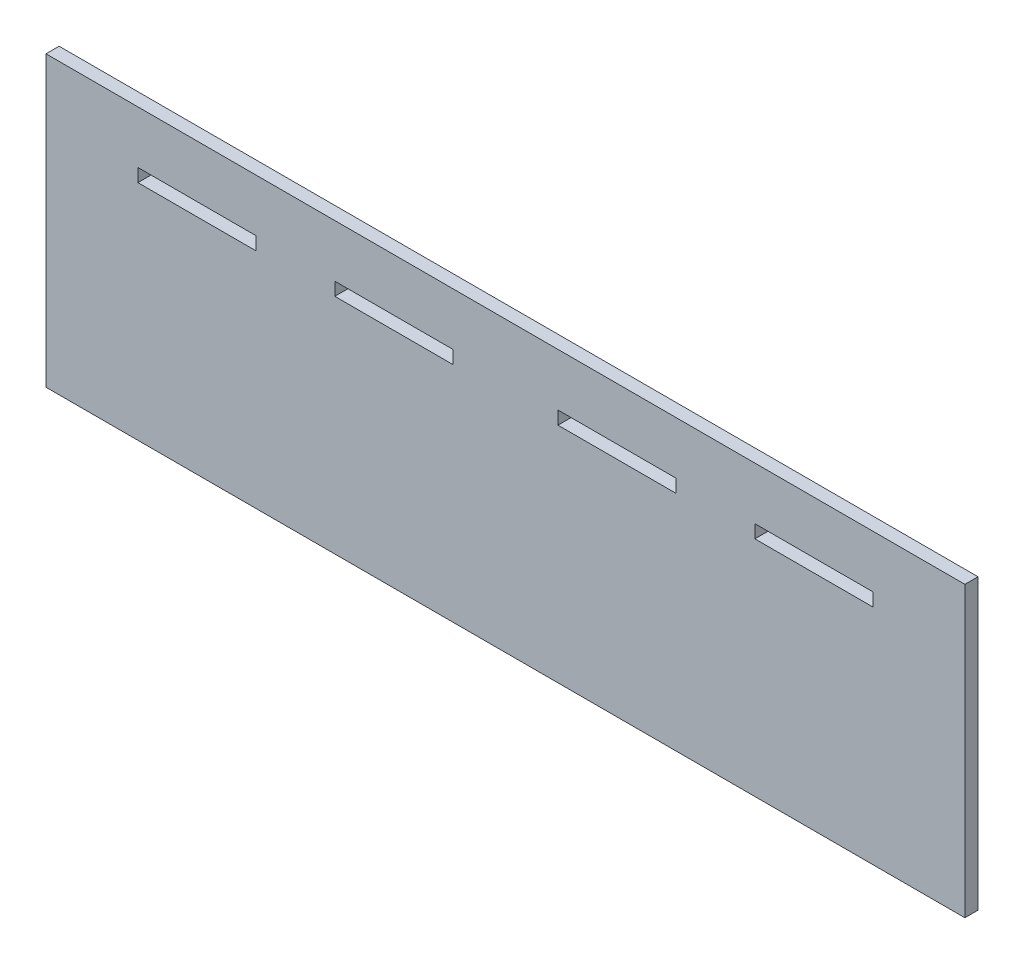
ISO-10303-21;
HEADER;
FILE_DESCRIPTION(('STEP AP214'),'2;1');
FILE_NAME('part.step','',(''),(''),'','','');
FILE_SCHEMA(('AUTOMOTIVE_DESIGN { 1 0 10303 214 1 1 1 1 }'));
ENDSEC;
DATA;
#1=APPLICATION_CONTEXT('core data for automotive mechanical design processes');
#2=APPLICATION_PROTOCOL_DEFINITION('international standard','automotive_design',2000,#1);
#3=PRODUCT_CONTEXT('',#1,'mechanical');
#4=PRODUCT('Part','Part','',(#3));
#5=PRODUCT_RELATED_PRODUCT_CATEGORY('part','',(#4));
#6=PRODUCT_DEFINITION_FORMATION('','',#4);
#7=PRODUCT_DEFINITION_CONTEXT('part definition',#1,'design');
#8=PRODUCT_DEFINITION('design','',#6,#7);
#9=PRODUCT_DEFINITION_SHAPE('','',#8);
#10=(LENGTH_UNIT() NAMED_UNIT(*) SI_UNIT(.MILLI.,.METRE.));
#11=(NAMED_UNIT(*) PLANE_ANGLE_UNIT() SI_UNIT($,.RADIAN.));
#12=(NAMED_UNIT(*) SI_UNIT($,.STERADIAN.) SOLID_ANGLE_UNIT());
#13=UNCERTAINTY_MEASURE_WITH_UNIT(LENGTH_MEASURE(1.E-05),#10,'distance_accuracy_value','');
#14=(GEOMETRIC_REPRESENTATION_CONTEXT(3) GLOBAL_UNCERTAINTY_ASSIGNED_CONTEXT((#13)) GLOBAL_UNIT_ASSIGNED_CONTEXT((#10,
#11,#12)) REPRESENTATION_CONTEXT('',''));
#15=CARTESIAN_POINT('',(0.,0.,0.));
#16=DIRECTION('',(0.,0.,1.));
#17=DIRECTION('',(1.,0.,0.));
#18=AXIS2_PLACEMENT_3D('',#15,#16,#17);
#19=CARTESIAN_POINT('',(0.,0.,10.));
#20=DIRECTION('',(0.,0.,-1.));
#21=DIRECTION('',(-1.,0.,0.));
#22=AXIS2_PLACEMENT_3D('',#19,#20,#21);
#23=PLANE('',#22);
#24=DIRECTION('',(0.,-1.,0.));
#25=VECTOR('',#24,1.);
#26=CARTESIAN_POINT('',(540.,180.,10.));
#27=LINE('',#26,#25);
#28=CARTESIAN_POINT('',(540.,180.,10.));
#29=VERTEX_POINT('',#28);
#30=CARTESIAN_POINT('',(540.,170.,10.));
#31=VERTEX_POINT('',#30);
#32=EDGE_CURVE('E206',#29,#31,#27,.T.);
#33=ORIENTED_EDGE('',*,*,#32,.F.);
#34=DIRECTION('',(-1.,0.,0.));
#35=VECTOR('',#34,1.);
#36=CARTESIAN_POINT('',(540.,180.,10.));
#37=LINE('',#36,#35);
#38=CARTESIAN_POINT('',(630.,180.,10.));
#39=VERTEX_POINT('',#38);
#40=EDGE_CURVE('E214',#39,#29,#37,.T.);
#41=ORIENTED_EDGE('',*,*,#40,.F.);
#42=DIRECTION('',(0.,1.,0.));
#43=VECTOR('',#42,1.);
#44=CARTESIAN_POINT('',(630.,180.,10.));
#45=LINE('',#44,#43);
#46=CARTESIAN_POINT('',(630.,170.,10.));
#47=VERTEX_POINT('',#46);
#48=EDGE_CURVE('E211',#47,#39,#45,.T.);
#49=ORIENTED_EDGE('',*,*,#48,.F.);
#50=DIRECTION('',(1.,0.,0.));
#51=VECTOR('',#50,1.);
#52=CARTESIAN_POINT('',(540.,170.,10.));
#53=LINE('',#52,#51);
#54=EDGE_CURVE('E208',#31,#47,#53,.T.);
#55=ORIENTED_EDGE('',*,*,#54,.F.);
#56=EDGE_LOOP('',(#33,#41,#49,#55));
#57=FACE_BOUND('',#56,.T.);
#58=DIRECTION('',(0.,-1.,0.));
#59=VECTOR('',#58,1.);
#60=CARTESIAN_POINT('',(220.,180.,10.));
#61=LINE('',#60,#59);
#62=CARTESIAN_POINT('',(220.,180.,10.));
#63=VERTEX_POINT('',#62);
#64=CARTESIAN_POINT('',(220.,170.,10.));
#65=VERTEX_POINT('',#64);
#66=EDGE_CURVE('E268',#63,#65,#61,.T.);
#67=ORIENTED_EDGE('',*,*,#66,.F.);
#68=DIRECTION('',(-1.,0.,0.));
#69=VECTOR('',#68,1.);
#70=CARTESIAN_POINT('',(220.,180.,10.));
#71=LINE('',#70,#69);
#72=CARTESIAN_POINT('',(310.,180.,10.));
#73=VERTEX_POINT('',#72);
#74=EDGE_CURVE('E276',#73,#63,#71,.T.);
#75=ORIENTED_EDGE('',*,*,#74,.F.);
#76=DIRECTION('',(0.,1.,0.));
#77=VECTOR('',#76,1.);
#78=CARTESIAN_POINT('',(310.,180.,10.));
#79=LINE('',#78,#77);
#80=CARTESIAN_POINT('',(310.,170.,10.));
#81=VERTEX_POINT('',#80);
#82=EDGE_CURVE('E273',#81,#73,#79,.T.);
#83=ORIENTED_EDGE('',*,*,#82,.F.);
#84=DIRECTION('',(1.,0.,0.));
#85=VECTOR('',#84,1.);
#86=CARTESIAN_POINT('',(220.,170.,10.));
#87=LINE('',#86,#85);
#88=EDGE_CURVE('E270',#65,#81,#87,.T.);
#89=ORIENTED_EDGE('',*,*,#88,.F.);
#90=EDGE_LOOP('',(#67,#75,#83,#89));
#91=FACE_BOUND('',#90,.T.);
#92=DIRECTION('',(0.,-1.,0.));
#93=VECTOR('',#92,1.);
#94=CARTESIAN_POINT('',(0.,0.,10.));
#95=LINE('',#94,#93);
#96=CARTESIAN_POINT('',(0.,220.,10.));
#97=VERTEX_POINT('',#96);
#98=CARTESIAN_POINT('',(0.,0.,10.));
#99=VERTEX_POINT('',#98);
#100=EDGE_CURVE('E299',#97,#99,#95,.T.);
#101=ORIENTED_EDGE('',*,*,#100,.T.);
#102=DIRECTION('',(1.,0.,0.));
#103=VECTOR('',#102,1.);
#104=CARTESIAN_POINT('',(0.,0.,10.));
#105=LINE('',#104,#103);
#106=CARTESIAN_POINT('',(700.,0.,10.));
#107=VERTEX_POINT('',#106);
#108=EDGE_CURVE('E302',#99,#107,#105,.T.);
#109=ORIENTED_EDGE('',*,*,#108,.T.);
#110=DIRECTION('',(0.,1.,0.));
#111=VECTOR('',#110,1.);
#112=CARTESIAN_POINT('',(700.,0.,10.));
#113=LINE('',#112,#111);
#114=CARTESIAN_POINT('',(700.,220.,10.));
#115=VERTEX_POINT('',#114);
#116=EDGE_CURVE('E305',#107,#115,#113,.T.);
#117=ORIENTED_EDGE('',*,*,#116,.T.);
#118=DIRECTION('',(-1.,0.,0.));
#119=VECTOR('',#118,1.);
#120=CARTESIAN_POINT('',(0.,220.,10.));
#121=LINE('',#120,#119);
#122=EDGE_CURVE('E307',#115,#97,#121,.T.);
#123=ORIENTED_EDGE('',*,*,#122,.T.);
#124=EDGE_LOOP('',(#101,#109,#117,#123));
#125=FACE_BOUND('',#124,.T.);
#126=DIRECTION('',(0.,-1.,0.));
#127=VECTOR('',#126,1.);
#128=CARTESIAN_POINT('',(390.,180.,10.));
#129=LINE('',#128,#127);
#130=CARTESIAN_POINT('',(390.,180.,10.));
#131=VERTEX_POINT('',#130);
#132=CARTESIAN_POINT('',(390.,170.,10.));
#133=VERTEX_POINT('',#132);
#134=EDGE_CURVE('E237',#131,#133,#129,.T.);
#135=ORIENTED_EDGE('',*,*,#134,.F.);
#136=DIRECTION('',(-1.,0.,0.));
#137=VECTOR('',#136,1.);
#138=CARTESIAN_POINT('',(390.,180.,10.));
#139=LINE('',#138,#137);
#140=CARTESIAN_POINT('',(480.,180.,10.));
#141=VERTEX_POINT('',#140);
#142=EDGE_CURVE('E245',#141,#131,#139,.T.);
#143=ORIENTED_EDGE('',*,*,#142,.F.);
#144=DIRECTION('',(0.,1.,0.));
#145=VECTOR('',#144,1.);
#146=CARTESIAN_POINT('',(480.,180.,10.));
#147=LINE('',#146,#145);
#148=CARTESIAN_POINT('',(480.,170.,10.));
#149=VERTEX_POINT('',#148);
#150=EDGE_CURVE('E242',#149,#141,#147,.T.);
#151=ORIENTED_EDGE('',*,*,#150,.F.);
#152=DIRECTION('',(1.,0.,0.));
#153=VECTOR('',#152,1.);
#154=CARTESIAN_POINT('',(390.,170.,10.));
#155=LINE('',#154,#153);
#156=EDGE_CURVE('E239',#133,#149,#155,.T.);
#157=ORIENTED_EDGE('',*,*,#156,.F.);
#158=EDGE_LOOP('',(#135,#143,#151,#157));
#159=FACE_BOUND('',#158,.T.);
#160=DIRECTION('',(0.,-1.,0.));
#161=VECTOR('',#160,1.);
#162=CARTESIAN_POINT('',(70.,180.,10.));
#163=LINE('',#162,#161);
#164=CARTESIAN_POINT('',(70.,180.,10.));
#165=VERTEX_POINT('',#164);
#166=CARTESIAN_POINT('',(70.,170.,10.));
#167=VERTEX_POINT('',#166);
#168=EDGE_CURVE('E170',#165,#167,#163,.T.);
#169=ORIENTED_EDGE('',*,*,#168,.F.);
#170=DIRECTION('',(-1.,0.,0.));
#171=VECTOR('',#170,1.);
#172=CARTESIAN_POINT('',(70.,180.,10.));
#173=LINE('',#172,#171);
#174=CARTESIAN_POINT('',(160.,180.,10.));
#175=VERTEX_POINT('',#174);
#176=EDGE_CURVE('E192',#175,#165,#173,.T.);
#177=ORIENTED_EDGE('',*,*,#176,.F.);
#178=DIRECTION('',(0.,1.,0.));
#179=VECTOR('',#178,1.);
#180=CARTESIAN_POINT('',(160.,180.,10.));
#181=LINE('',#180,#179);
#182=CARTESIAN_POINT('',(160.,170.,10.));
#183=VERTEX_POINT('',#182);
#184=EDGE_CURVE('E190',#183,#175,#181,.T.);
#185=ORIENTED_EDGE('',*,*,#184,.F.);
#186=DIRECTION('',(1.,0.,0.));
#187=VECTOR('',#186,1.);
#188=CARTESIAN_POINT('',(70.,170.,10.));
#189=LINE('',#188,#187);
#190=EDGE_CURVE('E178',#167,#183,#189,.T.);
#191=ORIENTED_EDGE('',*,*,#190,.F.);
#192=EDGE_LOOP('',(#169,#177,#185,#191));
#193=FACE_BOUND('',#192,.T.);
#194=ADVANCED_FACE('F33',(#57,#91,#125,#159,#193),#23,.F.);
#195=CARTESIAN_POINT('',(0.,0.,0.));
#196=DIRECTION('',(0.,0.,-1.));
#197=DIRECTION('',(-1.,0.,0.));
#198=AXIS2_PLACEMENT_3D('',#195,#196,#197);
#199=PLANE('',#198);
#200=DIRECTION('',(-1.,0.,0.));
#201=VECTOR('',#200,1.);
#202=CARTESIAN_POINT('',(540.,180.,0.));
#203=LINE('',#202,#201);
#204=CARTESIAN_POINT('',(630.,180.,0.));
#205=VERTEX_POINT('',#204);
#206=CARTESIAN_POINT('',(540.,180.,0.));
#207=VERTEX_POINT('',#206);
#208=EDGE_CURVE('E209',#205,#207,#203,.T.);
#209=ORIENTED_EDGE('',*,*,#208,.T.);
#210=DIRECTION('',(0.,-1.,0.));
#211=VECTOR('',#210,1.);
#212=CARTESIAN_POINT('',(540.,180.,0.));
#213=LINE('',#212,#211);
#214=CARTESIAN_POINT('',(540.,170.,0.));
#215=VERTEX_POINT('',#214);
#216=EDGE_CURVE('E186',#207,#215,#213,.T.);
#217=ORIENTED_EDGE('',*,*,#216,.T.);
#218=DIRECTION('',(1.,0.,0.));
#219=VECTOR('',#218,1.);
#220=CARTESIAN_POINT('',(540.,170.,0.));
#221=LINE('',#220,#219);
#222=CARTESIAN_POINT('',(630.,170.,0.));
#223=VERTEX_POINT('',#222);
#224=EDGE_CURVE('E219',#215,#223,#221,.T.);
#225=ORIENTED_EDGE('',*,*,#224,.T.);
#226=DIRECTION('',(0.,1.,0.));
#227=VECTOR('',#226,1.);
#228=CARTESIAN_POINT('',(630.,180.,0.));
#229=LINE('',#228,#227);
#230=EDGE_CURVE('E222',#223,#205,#229,.T.);
#231=ORIENTED_EDGE('',*,*,#230,.T.);
#232=EDGE_LOOP('',(#209,#217,#225,#231));
#233=FACE_BOUND('',#232,.T.);
#234=DIRECTION('',(-1.,0.,0.));
#235=VECTOR('',#234,1.);
#236=CARTESIAN_POINT('',(220.,180.,0.));
#237=LINE('',#236,#235);
#238=CARTESIAN_POINT('',(310.,180.,0.));
#239=VERTEX_POINT('',#238);
#240=CARTESIAN_POINT('',(220.,180.,0.));
#241=VERTEX_POINT('',#240);
#242=EDGE_CURVE('E271',#239,#241,#237,.T.);
#243=ORIENTED_EDGE('',*,*,#242,.T.);
#244=DIRECTION('',(0.,-1.,0.));
#245=VECTOR('',#244,1.);
#246=CARTESIAN_POINT('',(220.,180.,0.));
#247=LINE('',#246,#245);
#248=CARTESIAN_POINT('',(220.,170.,0.));
#249=VERTEX_POINT('',#248);
#250=EDGE_CURVE('E267',#241,#249,#247,.T.);
#251=ORIENTED_EDGE('',*,*,#250,.T.);
#252=DIRECTION('',(1.,0.,0.));
#253=VECTOR('',#252,1.);
#254=CARTESIAN_POINT('',(220.,170.,0.));
#255=LINE('',#254,#253);
#256=CARTESIAN_POINT('',(310.,170.,0.));
#257=VERTEX_POINT('',#256);
#258=EDGE_CURVE('E281',#249,#257,#255,.T.);
#259=ORIENTED_EDGE('',*,*,#258,.T.);
#260=DIRECTION('',(0.,1.,0.));
#261=VECTOR('',#260,1.);
#262=CARTESIAN_POINT('',(310.,180.,0.));
#263=LINE('',#262,#261);
#264=EDGE_CURVE('E284',#257,#239,#263,.T.);
#265=ORIENTED_EDGE('',*,*,#264,.T.);
#266=EDGE_LOOP('',(#243,#251,#259,#265));
#267=FACE_BOUND('',#266,.T.);
#268=DIRECTION('',(0.,-1.,0.));
#269=VECTOR('',#268,1.);
#270=CARTESIAN_POINT('',(0.,0.,0.));
#271=LINE('',#270,#269);
#272=CARTESIAN_POINT('',(0.,220.,0.));
#273=VERTEX_POINT('',#272);
#274=CARTESIAN_POINT('',(0.,0.,0.));
#275=VERTEX_POINT('',#274);
#276=EDGE_CURVE('E298',#273,#275,#271,.T.);
#277=ORIENTED_EDGE('',*,*,#276,.F.);
#278=DIRECTION('',(-1.,0.,0.));
#279=VECTOR('',#278,1.);
#280=CARTESIAN_POINT('',(0.,220.,0.));
#281=LINE('',#280,#279);
#282=CARTESIAN_POINT('',(700.,220.,0.));
#283=VERTEX_POINT('',#282);
#284=EDGE_CURVE('E303',#283,#273,#281,.T.);
#285=ORIENTED_EDGE('',*,*,#284,.F.);
#286=DIRECTION('',(0.,1.,0.));
#287=VECTOR('',#286,1.);
#288=CARTESIAN_POINT('',(700.,0.,0.));
#289=LINE('',#288,#287);
#290=CARTESIAN_POINT('',(700.,0.,0.));
#291=VERTEX_POINT('',#290);
#292=EDGE_CURVE('E314',#291,#283,#289,.T.);
#293=ORIENTED_EDGE('',*,*,#292,.F.);
#294=DIRECTION('',(1.,0.,0.));
#295=VECTOR('',#294,1.);
#296=CARTESIAN_POINT('',(0.,0.,0.));
#297=LINE('',#296,#295);
#298=EDGE_CURVE('E312',#275,#291,#297,.T.);
#299=ORIENTED_EDGE('',*,*,#298,.F.);
#300=EDGE_LOOP('',(#277,#285,#293,#299));
#301=FACE_BOUND('',#300,.T.);
#302=DIRECTION('',(-1.,0.,0.));
#303=VECTOR('',#302,1.);
#304=CARTESIAN_POINT('',(390.,180.,0.));
#305=LINE('',#304,#303);
#306=CARTESIAN_POINT('',(480.,180.,0.));
#307=VERTEX_POINT('',#306);
#308=CARTESIAN_POINT('',(390.,180.,0.));
#309=VERTEX_POINT('',#308);
#310=EDGE_CURVE('E240',#307,#309,#305,.T.);
#311=ORIENTED_EDGE('',*,*,#310,.T.);
#312=DIRECTION('',(0.,-1.,0.));
#313=VECTOR('',#312,1.);
#314=CARTESIAN_POINT('',(390.,180.,0.));
#315=LINE('',#314,#313);
#316=CARTESIAN_POINT('',(390.,170.,0.));
#317=VERTEX_POINT('',#316);
#318=EDGE_CURVE('E236',#309,#317,#315,.T.);
#319=ORIENTED_EDGE('',*,*,#318,.T.);
#320=DIRECTION('',(1.,0.,0.));
#321=VECTOR('',#320,1.);
#322=CARTESIAN_POINT('',(390.,170.,0.));
#323=LINE('',#322,#321);
#324=CARTESIAN_POINT('',(480.,170.,0.));
#325=VERTEX_POINT('',#324);
#326=EDGE_CURVE('E250',#317,#325,#323,.T.);
#327=ORIENTED_EDGE('',*,*,#326,.T.);
#328=DIRECTION('',(0.,1.,0.));
#329=VECTOR('',#328,1.);
#330=CARTESIAN_POINT('',(480.,180.,0.));
#331=LINE('',#330,#329);
#332=EDGE_CURVE('E253',#325,#307,#331,.T.);
#333=ORIENTED_EDGE('',*,*,#332,.T.);
#334=EDGE_LOOP('',(#311,#319,#327,#333));
#335=FACE_BOUND('',#334,.T.);
#336=DIRECTION('',(-1.,0.,0.));
#337=VECTOR('',#336,1.);
#338=CARTESIAN_POINT('',(70.,180.,0.));
#339=LINE('',#338,#337);
#340=CARTESIAN_POINT('',(160.,180.,0.));
#341=VERTEX_POINT('',#340);
#342=CARTESIAN_POINT('',(70.,180.,0.));
#343=VERTEX_POINT('',#342);
#344=EDGE_CURVE('E179',#341,#343,#339,.T.);
#345=ORIENTED_EDGE('',*,*,#344,.T.);
#346=DIRECTION('',(0.,-1.,0.));
#347=VECTOR('',#346,1.);
#348=CARTESIAN_POINT('',(70.,180.,0.));
#349=LINE('',#348,#347);
#350=CARTESIAN_POINT('',(70.,170.,0.));
#351=VERTEX_POINT('',#350);
#352=EDGE_CURVE('E56',#343,#351,#349,.T.);
#353=ORIENTED_EDGE('',*,*,#352,.T.);
#354=DIRECTION('',(1.,0.,0.));
#355=VECTOR('',#354,1.);
#356=CARTESIAN_POINT('',(70.,170.,0.));
#357=LINE('',#356,#355);
#358=CARTESIAN_POINT('',(160.,170.,0.));
#359=VERTEX_POINT('',#358);
#360=EDGE_CURVE('E185',#351,#359,#357,.T.);
#361=ORIENTED_EDGE('',*,*,#360,.T.);
#362=DIRECTION('',(0.,1.,0.));
#363=VECTOR('',#362,1.);
#364=CARTESIAN_POINT('',(160.,180.,0.));
#365=LINE('',#364,#363);
#366=EDGE_CURVE('E198',#359,#341,#365,.T.);
#367=ORIENTED_EDGE('',*,*,#366,.T.);
#368=EDGE_LOOP('',(#345,#353,#361,#367));
#369=FACE_BOUND('',#368,.T.);
#370=ADVANCED_FACE('F332',(#233,#267,#301,#335,#369),#199,.T.);
#371=CARTESIAN_POINT('',(0.,0.,10.));
#372=DIRECTION('',(1.,0.,0.));
#373=DIRECTION('',(0.,0.,-1.));
#374=AXIS2_PLACEMENT_3D('',#371,#372,#373);
#375=PLANE('',#374);
#376=ORIENTED_EDGE('',*,*,#276,.T.);
#377=DIRECTION('',(0.,0.,-1.));
#378=VECTOR('',#377,1.);
#379=CARTESIAN_POINT('',(0.,0.,10.));
#380=LINE('',#379,#378);
#381=EDGE_CURVE('E11',#99,#275,#380,.T.);
#382=ORIENTED_EDGE('',*,*,#381,.F.);
#383=ORIENTED_EDGE('',*,*,#100,.F.);
#384=DIRECTION('',(0.,0.,-1.));
#385=VECTOR('',#384,1.);
#386=CARTESIAN_POINT('',(0.,220.,10.));
#387=LINE('',#386,#385);
#388=EDGE_CURVE('E309',#97,#273,#387,.T.);
#389=ORIENTED_EDGE('',*,*,#388,.T.);
#390=EDGE_LOOP('',(#376,#382,#383,#389));
#391=FACE_BOUND('',#390,.T.);
#392=ADVANCED_FACE('F35',(#391),#375,.F.);
#393=CARTESIAN_POINT('',(0.,0.,10.));
#394=DIRECTION('',(0.,1.,0.));
#395=DIRECTION('',(0.,0.,1.));
#396=AXIS2_PLACEMENT_3D('',#393,#394,#395);
#397=PLANE('',#396);
#398=ORIENTED_EDGE('',*,*,#298,.T.);
#399=DIRECTION('',(0.,0.,-1.));
#400=VECTOR('',#399,1.);
#401=CARTESIAN_POINT('',(700.,0.,10.));
#402=LINE('',#401,#400);
#403=EDGE_CURVE('E41',#107,#291,#402,.T.);
#404=ORIENTED_EDGE('',*,*,#403,.F.);
#405=ORIENTED_EDGE('',*,*,#108,.F.);
#406=ORIENTED_EDGE('',*,*,#381,.T.);
#407=EDGE_LOOP('',(#398,#404,#405,#406));
#408=FACE_BOUND('',#407,.T.);
#409=ADVANCED_FACE('F343',(#408),#397,.F.);
#410=CARTESIAN_POINT('',(700.,0.,10.));
#411=DIRECTION('',(-1.,0.,0.));
#412=DIRECTION('',(0.,0.,1.));
#413=AXIS2_PLACEMENT_3D('',#410,#411,#412);
#414=PLANE('',#413);
#415=ORIENTED_EDGE('',*,*,#292,.T.);
#416=DIRECTION('',(0.,0.,-1.));
#417=VECTOR('',#416,1.);
#418=CARTESIAN_POINT('',(700.,220.,10.));
#419=LINE('',#418,#417);
#420=EDGE_CURVE('E319',#115,#283,#419,.T.);
#421=ORIENTED_EDGE('',*,*,#420,.F.);
#422=ORIENTED_EDGE('',*,*,#116,.F.);
#423=ORIENTED_EDGE('',*,*,#403,.T.);
#424=EDGE_LOOP('',(#415,#421,#422,#423));
#425=FACE_BOUND('',#424,.T.);
#426=ADVANCED_FACE('F326',(#425),#414,.F.);
#427=CARTESIAN_POINT('',(0.,220.,10.));
#428=DIRECTION('',(0.,-1.,0.));
#429=DIRECTION('',(0.,0.,-1.));
#430=AXIS2_PLACEMENT_3D('',#427,#428,#429);
#431=PLANE('',#430);
#432=ORIENTED_EDGE('',*,*,#284,.T.);
#433=ORIENTED_EDGE('',*,*,#388,.F.);
#434=ORIENTED_EDGE('',*,*,#122,.F.);
#435=ORIENTED_EDGE('',*,*,#420,.T.);
#436=EDGE_LOOP('',(#432,#433,#434,#435));
#437=FACE_BOUND('',#436,.T.);
#438=ADVANCED_FACE('F336',(#437),#431,.F.);
#439=CARTESIAN_POINT('',(220.,180.,10.));
#440=DIRECTION('',(1.,0.,0.));
#441=DIRECTION('',(0.,0.,-1.));
#442=AXIS2_PLACEMENT_3D('',#439,#440,#441);
#443=PLANE('',#442);
#444=ORIENTED_EDGE('',*,*,#250,.F.);
#445=DIRECTION('',(0.,0.,-1.));
#446=VECTOR('',#445,1.);
#447=CARTESIAN_POINT('',(220.,180.,10.));
#448=LINE('',#447,#446);
#449=EDGE_CURVE('E278',#63,#241,#448,.T.);
#450=ORIENTED_EDGE('',*,*,#449,.F.);
#451=ORIENTED_EDGE('',*,*,#66,.T.);
#452=DIRECTION('',(0.,0.,-1.));
#453=VECTOR('',#452,1.);
#454=CARTESIAN_POINT('',(220.,170.,10.));
#455=LINE('',#454,#453);
#456=EDGE_CURVE('E295',#65,#249,#455,.T.);
#457=ORIENTED_EDGE('',*,*,#456,.T.);
#458=EDGE_LOOP('',(#444,#450,#451,#457));
#459=FACE_BOUND('',#458,.T.);
#460=ADVANCED_FACE('F361',(#459),#443,.T.);
#461=CARTESIAN_POINT('',(220.,170.,10.));
#462=DIRECTION('',(0.,1.,0.));
#463=DIRECTION('',(0.,0.,1.));
#464=AXIS2_PLACEMENT_3D('',#461,#462,#463);
#465=PLANE('',#464);
#466=ORIENTED_EDGE('',*,*,#258,.F.);
#467=ORIENTED_EDGE('',*,*,#456,.F.);
#468=ORIENTED_EDGE('',*,*,#88,.T.);
#469=DIRECTION('',(0.,0.,-1.));
#470=VECTOR('',#469,1.);
#471=CARTESIAN_POINT('',(310.,170.,10.));
#472=LINE('',#471,#470);
#473=EDGE_CURVE('E293',#81,#257,#472,.T.);
#474=ORIENTED_EDGE('',*,*,#473,.T.);
#475=EDGE_LOOP('',(#466,#467,#468,#474));
#476=FACE_BOUND('',#475,.T.);
#477=ADVANCED_FACE('F368',(#476),#465,.T.);
#478=CARTESIAN_POINT('',(310.,180.,10.));
#479=DIRECTION('',(-1.,0.,0.));
#480=DIRECTION('',(0.,0.,1.));
#481=AXIS2_PLACEMENT_3D('',#478,#479,#480);
#482=PLANE('',#481);
#483=ORIENTED_EDGE('',*,*,#264,.F.);
#484=ORIENTED_EDGE('',*,*,#473,.F.);
#485=ORIENTED_EDGE('',*,*,#82,.T.);
#486=DIRECTION('',(0.,0.,-1.));
#487=VECTOR('',#486,1.);
#488=CARTESIAN_POINT('',(310.,180.,10.));
#489=LINE('',#488,#487);
#490=EDGE_CURVE('E291',#73,#239,#489,.T.);
#491=ORIENTED_EDGE('',*,*,#490,.T.);
#492=EDGE_LOOP('',(#483,#484,#485,#491));
#493=FACE_BOUND('',#492,.T.);
#494=ADVANCED_FACE('F373',(#493),#482,.T.);
#495=CARTESIAN_POINT('',(220.,180.,10.));
#496=DIRECTION('',(0.,-1.,0.));
#497=DIRECTION('',(0.,0.,-1.));
#498=AXIS2_PLACEMENT_3D('',#495,#496,#497);
#499=PLANE('',#498);
#500=ORIENTED_EDGE('',*,*,#242,.F.);
#501=ORIENTED_EDGE('',*,*,#490,.F.);
#502=ORIENTED_EDGE('',*,*,#74,.T.);
#503=ORIENTED_EDGE('',*,*,#449,.T.);
#504=EDGE_LOOP('',(#500,#501,#502,#503));
#505=FACE_BOUND('',#504,.T.);
#506=ADVANCED_FACE('F381',(#505),#499,.T.);
#507=CARTESIAN_POINT('',(390.,180.,10.));
#508=DIRECTION('',(1.,0.,0.));
#509=DIRECTION('',(0.,0.,-1.));
#510=AXIS2_PLACEMENT_3D('',#507,#508,#509);
#511=PLANE('',#510);
#512=ORIENTED_EDGE('',*,*,#318,.F.);
#513=DIRECTION('',(0.,0.,-1.));
#514=VECTOR('',#513,1.);
#515=CARTESIAN_POINT('',(390.,180.,10.));
#516=LINE('',#515,#514);
#517=EDGE_CURVE('E247',#131,#309,#516,.T.);
#518=ORIENTED_EDGE('',*,*,#517,.F.);
#519=ORIENTED_EDGE('',*,*,#134,.T.);
#520=DIRECTION('',(0.,0.,-1.));
#521=VECTOR('',#520,1.);
#522=CARTESIAN_POINT('',(390.,170.,10.));
#523=LINE('',#522,#521);
#524=EDGE_CURVE('E264',#133,#317,#523,.T.);
#525=ORIENTED_EDGE('',*,*,#524,.T.);
#526=EDGE_LOOP('',(#512,#518,#519,#525));
#527=FACE_BOUND('',#526,.T.);
#528=ADVANCED_FACE('F393',(#527),#511,.T.);
#529=CARTESIAN_POINT('',(390.,170.,10.));
#530=DIRECTION('',(0.,1.,0.));
#531=DIRECTION('',(0.,0.,1.));
#532=AXIS2_PLACEMENT_3D('',#529,#530,#531);
#533=PLANE('',#532);
#534=ORIENTED_EDGE('',*,*,#326,.F.);
#535=ORIENTED_EDGE('',*,*,#524,.F.);
#536=ORIENTED_EDGE('',*,*,#156,.T.);
#537=DIRECTION('',(0.,0.,-1.));
#538=VECTOR('',#537,1.);
#539=CARTESIAN_POINT('',(480.,170.,10.));
#540=LINE('',#539,#538);
#541=EDGE_CURVE('E262',#149,#325,#540,.T.);
#542=ORIENTED_EDGE('',*,*,#541,.T.);
#543=EDGE_LOOP('',(#534,#535,#536,#542));
#544=FACE_BOUND('',#543,.T.);
#545=ADVANCED_FACE('F398',(#544),#533,.T.);
#546=CARTESIAN_POINT('',(480.,180.,10.));
#547=DIRECTION('',(-1.,0.,0.));
#548=DIRECTION('',(0.,0.,1.));
#549=AXIS2_PLACEMENT_3D('',#546,#547,#548);
#550=PLANE('',#549);
#551=ORIENTED_EDGE('',*,*,#332,.F.);
#552=ORIENTED_EDGE('',*,*,#541,.F.);
#553=ORIENTED_EDGE('',*,*,#150,.T.);
#554=DIRECTION('',(0.,0.,-1.));
#555=VECTOR('',#554,1.);
#556=CARTESIAN_POINT('',(480.,180.,10.));
#557=LINE('',#556,#555);
#558=EDGE_CURVE('E260',#141,#307,#557,.T.);
#559=ORIENTED_EDGE('',*,*,#558,.T.);
#560=EDGE_LOOP('',(#551,#552,#553,#559));
#561=FACE_BOUND('',#560,.T.);
#562=ADVANCED_FACE('F402',(#561),#550,.T.);
#563=CARTESIAN_POINT('',(390.,180.,10.));
#564=DIRECTION('',(0.,-1.,0.));
#565=DIRECTION('',(0.,0.,-1.));
#566=AXIS2_PLACEMENT_3D('',#563,#564,#565);
#567=PLANE('',#566);
#568=ORIENTED_EDGE('',*,*,#310,.F.);
#569=ORIENTED_EDGE('',*,*,#558,.F.);
#570=ORIENTED_EDGE('',*,*,#142,.T.);
#571=ORIENTED_EDGE('',*,*,#517,.T.);
#572=EDGE_LOOP('',(#568,#569,#570,#571));
#573=FACE_BOUND('',#572,.T.);
#574=ADVANCED_FACE('F406',(#573),#567,.T.);
#575=CARTESIAN_POINT('',(540.,180.,10.));
#576=DIRECTION('',(1.,0.,0.));
#577=DIRECTION('',(0.,0.,-1.));
#578=AXIS2_PLACEMENT_3D('',#575,#576,#577);
#579=PLANE('',#578);
#580=ORIENTED_EDGE('',*,*,#216,.F.);
#581=DIRECTION('',(0.,0.,-1.));
#582=VECTOR('',#581,1.);
#583=CARTESIAN_POINT('',(540.,180.,10.));
#584=LINE('',#583,#582);
#585=EDGE_CURVE('E216',#29,#207,#584,.T.);
#586=ORIENTED_EDGE('',*,*,#585,.F.);
#587=ORIENTED_EDGE('',*,*,#32,.T.);
#588=DIRECTION('',(0.,0.,-1.));
#589=VECTOR('',#588,1.);
#590=CARTESIAN_POINT('',(540.,170.,10.));
#591=LINE('',#590,#589);
#592=EDGE_CURVE('E233',#31,#215,#591,.T.);
#593=ORIENTED_EDGE('',*,*,#592,.T.);
#594=EDGE_LOOP('',(#580,#586,#587,#593));
#595=FACE_BOUND('',#594,.T.);
#596=ADVANCED_FACE('F410',(#595),#579,.T.);
#597=CARTESIAN_POINT('',(540.,170.,10.));
#598=DIRECTION('',(0.,1.,0.));
#599=DIRECTION('',(0.,0.,1.));
#600=AXIS2_PLACEMENT_3D('',#597,#598,#599);
#601=PLANE('',#600);
#602=ORIENTED_EDGE('',*,*,#224,.F.);
#603=ORIENTED_EDGE('',*,*,#592,.F.);
#604=ORIENTED_EDGE('',*,*,#54,.T.);
#605=DIRECTION('',(0.,0.,-1.));
#606=VECTOR('',#605,1.);
#607=CARTESIAN_POINT('',(630.,170.,10.));
#608=LINE('',#607,#606);
#609=EDGE_CURVE('E231',#47,#223,#608,.T.);
#610=ORIENTED_EDGE('',*,*,#609,.T.);
#611=EDGE_LOOP('',(#602,#603,#604,#610));
#612=FACE_BOUND('',#611,.T.);
#613=ADVANCED_FACE('F414',(#612),#601,.T.);
#614=CARTESIAN_POINT('',(630.,180.,10.));
#615=DIRECTION('',(-1.,0.,0.));
#616=DIRECTION('',(0.,0.,1.));
#617=AXIS2_PLACEMENT_3D('',#614,#615,#616);
#618=PLANE('',#617);
#619=ORIENTED_EDGE('',*,*,#230,.F.);
#620=ORIENTED_EDGE('',*,*,#609,.F.);
#621=ORIENTED_EDGE('',*,*,#48,.T.);
#622=DIRECTION('',(0.,0.,-1.));
#623=VECTOR('',#622,1.);
#624=CARTESIAN_POINT('',(630.,180.,10.));
#625=LINE('',#624,#623);
#626=EDGE_CURVE('E229',#39,#205,#625,.T.);
#627=ORIENTED_EDGE('',*,*,#626,.T.);
#628=EDGE_LOOP('',(#619,#620,#621,#627));
#629=FACE_BOUND('',#628,.T.);
#630=ADVANCED_FACE('F418',(#629),#618,.T.);
#631=CARTESIAN_POINT('',(540.,180.,10.));
#632=DIRECTION('',(0.,-1.,0.));
#633=DIRECTION('',(0.,0.,-1.));
#634=AXIS2_PLACEMENT_3D('',#631,#632,#633);
#635=PLANE('',#634);
#636=ORIENTED_EDGE('',*,*,#208,.F.);
#637=ORIENTED_EDGE('',*,*,#626,.F.);
#638=ORIENTED_EDGE('',*,*,#40,.T.);
#639=ORIENTED_EDGE('',*,*,#585,.T.);
#640=EDGE_LOOP('',(#636,#637,#638,#639));
#641=FACE_BOUND('',#640,.T.);
#642=ADVANCED_FACE('F422',(#641),#635,.T.);
#643=CARTESIAN_POINT('',(70.,180.,10.));
#644=DIRECTION('',(1.,0.,0.));
#645=DIRECTION('',(0.,0.,-1.));
#646=AXIS2_PLACEMENT_3D('',#643,#644,#645);
#647=PLANE('',#646);
#648=ORIENTED_EDGE('',*,*,#352,.F.);
#649=DIRECTION('',(0.,0.,-1.));
#650=VECTOR('',#649,1.);
#651=CARTESIAN_POINT('',(70.,180.,10.));
#652=LINE('',#651,#650);
#653=EDGE_CURVE('E174',#165,#343,#652,.T.);
#654=ORIENTED_EDGE('',*,*,#653,.F.);
#655=ORIENTED_EDGE('',*,*,#168,.T.);
#656=DIRECTION('',(0.,0.,-1.));
#657=VECTOR('',#656,1.);
#658=CARTESIAN_POINT('',(70.,170.,10.));
#659=LINE('',#658,#657);
#660=EDGE_CURVE('E173',#167,#351,#659,.T.);
#661=ORIENTED_EDGE('',*,*,#660,.T.);
#662=EDGE_LOOP('',(#648,#654,#655,#661));
#663=FACE_BOUND('',#662,.T.);
#664=ADVANCED_FACE('F172',(#663),#647,.T.);
#665=CARTESIAN_POINT('',(70.,170.,10.));
#666=DIRECTION('',(0.,1.,0.));
#667=DIRECTION('',(0.,0.,1.));
#668=AXIS2_PLACEMENT_3D('',#665,#666,#667);
#669=PLANE('',#668);
#670=ORIENTED_EDGE('',*,*,#360,.F.);
#671=ORIENTED_EDGE('',*,*,#660,.F.);
#672=ORIENTED_EDGE('',*,*,#190,.T.);
#673=DIRECTION('',(0.,0.,-1.));
#674=VECTOR('',#673,1.);
#675=CARTESIAN_POINT('',(160.,170.,10.));
#676=LINE('',#675,#674);
#677=EDGE_CURVE('E187',#183,#359,#676,.T.);
#678=ORIENTED_EDGE('',*,*,#677,.T.);
#679=EDGE_LOOP('',(#670,#671,#672,#678));
#680=FACE_BOUND('',#679,.T.);
#681=ADVANCED_FACE('F182',(#680),#669,.T.);
#682=CARTESIAN_POINT('',(160.,180.,10.));
#683=DIRECTION('',(-1.,0.,0.));
#684=DIRECTION('',(0.,0.,1.));
#685=AXIS2_PLACEMENT_3D('',#682,#683,#684);
#686=PLANE('',#685);
#687=ORIENTED_EDGE('',*,*,#366,.F.);
#688=ORIENTED_EDGE('',*,*,#677,.F.);
#689=ORIENTED_EDGE('',*,*,#184,.T.);
#690=DIRECTION('',(0.,0.,-1.));
#691=VECTOR('',#690,1.);
#692=CARTESIAN_POINT('',(160.,180.,10.));
#693=LINE('',#692,#691);
#694=EDGE_CURVE('E48',#175,#341,#693,.T.);
#695=ORIENTED_EDGE('',*,*,#694,.T.);
#696=EDGE_LOOP('',(#687,#688,#689,#695));
#697=FACE_BOUND('',#696,.T.);
#698=ADVANCED_FACE('F431',(#697),#686,.T.);
#699=CARTESIAN_POINT('',(70.,180.,10.));
#700=DIRECTION('',(0.,-1.,0.));
#701=DIRECTION('',(0.,0.,-1.));
#702=AXIS2_PLACEMENT_3D('',#699,#700,#701);
#703=PLANE('',#702);
#704=ORIENTED_EDGE('',*,*,#344,.F.);
#705=ORIENTED_EDGE('',*,*,#694,.F.);
#706=ORIENTED_EDGE('',*,*,#176,.T.);
#707=ORIENTED_EDGE('',*,*,#653,.T.);
#708=EDGE_LOOP('',(#704,#705,#706,#707));
#709=FACE_BOUND('',#708,.T.);
#710=ADVANCED_FACE('F434',(#709),#703,.T.);
#711=CLOSED_SHELL('',(#194,#370,#392,#409,#426,#438,#460,#477,#494,#506,#528,#545,#562,#574,
#596,#613,#630,#642,#664,#681,#698,#710));
#712=MANIFOLD_SOLID_BREP('B2',#711);
#713=ADVANCED_BREP_SHAPE_REPRESENTATION('',(#18,#712),#14);
#714=SHAPE_DEFINITION_REPRESENTATION(#9,#713);
ENDSEC;
END-ISO-10303-21;
